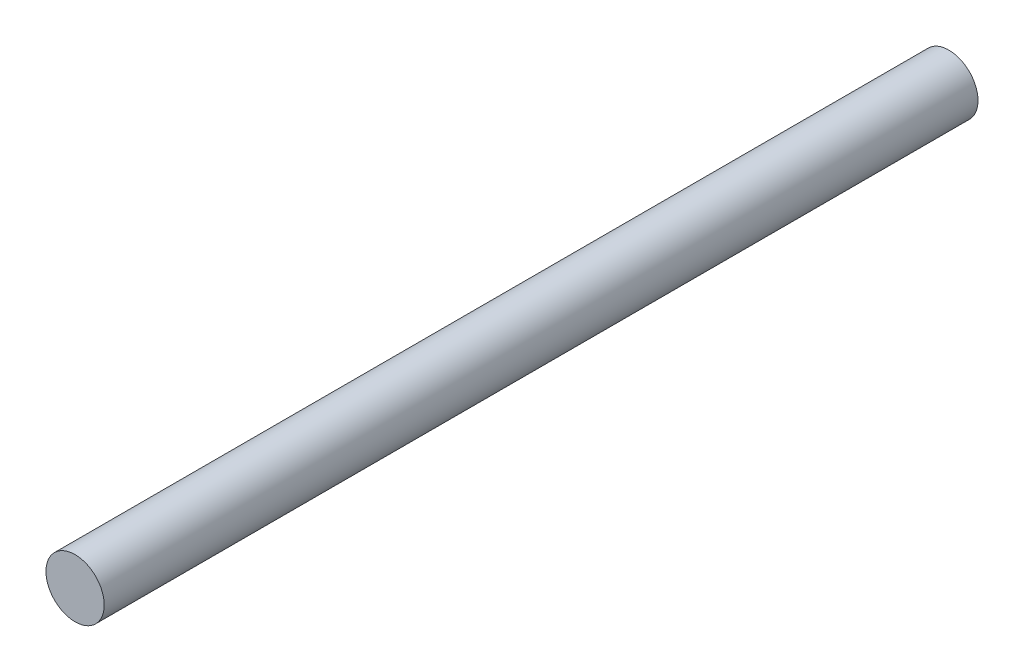
ISO-10303-21;
HEADER;
FILE_DESCRIPTION(('STEP AP214'),'2;1');
FILE_NAME('part.step','',(''),(''),'','','');
FILE_SCHEMA(('AUTOMOTIVE_DESIGN { 1 0 10303 214 1 1 1 1 }'));
ENDSEC;
DATA;
#1=APPLICATION_CONTEXT('core data for automotive mechanical design processes');
#2=APPLICATION_PROTOCOL_DEFINITION('international standard','automotive_design',2000,#1);
#3=PRODUCT_CONTEXT('',#1,'mechanical');
#4=PRODUCT('Part','Part','',(#3));
#5=PRODUCT_RELATED_PRODUCT_CATEGORY('part','',(#4));
#6=PRODUCT_DEFINITION_FORMATION('','',#4);
#7=PRODUCT_DEFINITION_CONTEXT('part definition',#1,'design');
#8=PRODUCT_DEFINITION('design','',#6,#7);
#9=PRODUCT_DEFINITION_SHAPE('','',#8);
#10=(LENGTH_UNIT() NAMED_UNIT(*) SI_UNIT(.MILLI.,.METRE.));
#11=(NAMED_UNIT(*) PLANE_ANGLE_UNIT() SI_UNIT($,.RADIAN.));
#12=(NAMED_UNIT(*) SI_UNIT($,.STERADIAN.) SOLID_ANGLE_UNIT());
#13=UNCERTAINTY_MEASURE_WITH_UNIT(LENGTH_MEASURE(1.E-05),#10,'distance_accuracy_value','');
#14=(GEOMETRIC_REPRESENTATION_CONTEXT(3) GLOBAL_UNCERTAINTY_ASSIGNED_CONTEXT((#13)) GLOBAL_UNIT_ASSIGNED_CONTEXT((#10,
#11,#12)) REPRESENTATION_CONTEXT('',''));
#15=CARTESIAN_POINT('',(0.,0.,0.));
#16=DIRECTION('',(0.,0.,1.));
#17=DIRECTION('',(1.,0.,0.));
#18=AXIS2_PLACEMENT_3D('',#15,#16,#17);
#19=CARTESIAN_POINT('',(0.,0.,120.));
#20=DIRECTION('',(0.,0.,-1.));
#21=DIRECTION('',(-1.,0.,0.));
#22=AXIS2_PLACEMENT_3D('',#19,#20,#21);
#23=CYLINDRICAL_SURFACE('',#22,4.);
#24=CARTESIAN_POINT('',(0.,0.,120.));
#25=DIRECTION('',(0.,0.,1.));
#26=DIRECTION('',(1.,0.,0.));
#27=AXIS2_PLACEMENT_3D('',#24,#25,#26);
#28=CIRCLE('',#27,4.);
#29=CARTESIAN_POINT('',(4.,0.,120.));
#30=VERTEX_POINT('',#29);
#31=EDGE_CURVE('E10',#30,#30,#28,.T.);
#32=ORIENTED_EDGE('',*,*,#31,.F.);
#33=EDGE_LOOP('',(#32));
#34=FACE_BOUND('',#33,.T.);
#35=CARTESIAN_POINT('',(0.,0.,0.));
#36=DIRECTION('',(0.,0.,1.));
#37=DIRECTION('',(1.,0.,0.));
#38=AXIS2_PLACEMENT_3D('',#35,#36,#37);
#39=CIRCLE('',#38,4.);
#40=CARTESIAN_POINT('',(4.,0.,0.));
#41=VERTEX_POINT('',#40);
#42=EDGE_CURVE('E33',#41,#41,#39,.T.);
#43=ORIENTED_EDGE('',*,*,#42,.T.);
#44=EDGE_LOOP('',(#43));
#45=FACE_BOUND('',#44,.T.);
#46=ADVANCED_FACE('F30',(#34,#45),#23,.T.);
#47=CARTESIAN_POINT('',(0.,0.,120.));
#48=DIRECTION('',(0.,0.,1.));
#49=DIRECTION('',(1.,0.,0.));
#50=AXIS2_PLACEMENT_3D('',#47,#48,#49);
#51=PLANE('',#50);
#52=ORIENTED_EDGE('',*,*,#31,.T.);
#53=EDGE_LOOP('',(#52));
#54=FACE_BOUND('',#53,.T.);
#55=ADVANCED_FACE('F45',(#54),#51,.T.);
#56=CARTESIAN_POINT('',(0.,0.,0.));
#57=DIRECTION('',(0.,0.,1.));
#58=DIRECTION('',(1.,0.,0.));
#59=AXIS2_PLACEMENT_3D('',#56,#57,#58);
#60=PLANE('',#59);
#61=ORIENTED_EDGE('',*,*,#42,.F.);
#62=EDGE_LOOP('',(#61));
#63=FACE_BOUND('',#62,.T.);
#64=ADVANCED_FACE('F43',(#63),#60,.F.);
#65=CLOSED_SHELL('',(#46,#55,#64));
#66=MANIFOLD_SOLID_BREP('B2',#65);
#67=ADVANCED_BREP_SHAPE_REPRESENTATION('',(#18,#66),#14);
#68=SHAPE_DEFINITION_REPRESENTATION(#9,#67);
ENDSEC;
END-ISO-10303-21;
